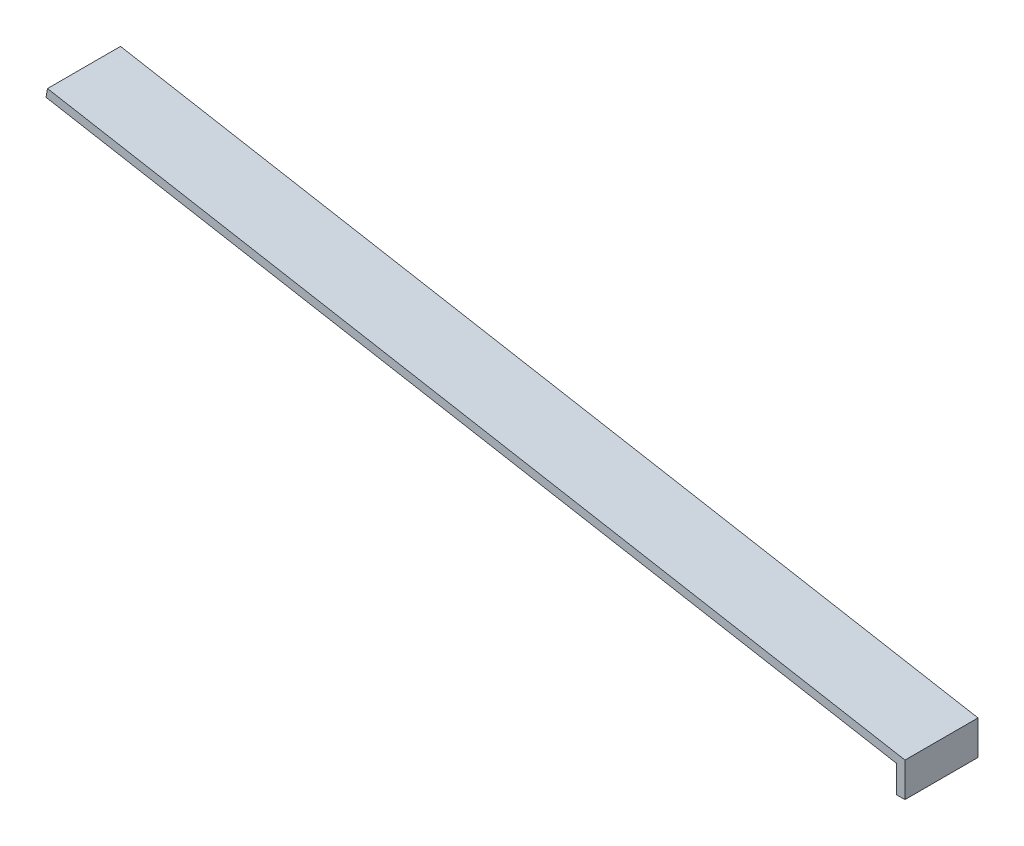
ISO-10303-21;
HEADER;
FILE_DESCRIPTION(('STEP AP214'),'2;1');
FILE_NAME('part.step','',(''),(''),'','','');
FILE_SCHEMA(('AUTOMOTIVE_DESIGN { 1 0 10303 214 1 1 1 1 }'));
ENDSEC;
DATA;
#1=APPLICATION_CONTEXT('core data for automotive mechanical design processes');
#2=APPLICATION_PROTOCOL_DEFINITION('international standard','automotive_design',2000,#1);
#3=PRODUCT_CONTEXT('',#1,'mechanical');
#4=PRODUCT('Part','Part','',(#3));
#5=PRODUCT_RELATED_PRODUCT_CATEGORY('part','',(#4));
#6=PRODUCT_DEFINITION_FORMATION('','',#4);
#7=PRODUCT_DEFINITION_CONTEXT('part definition',#1,'design');
#8=PRODUCT_DEFINITION('design','',#6,#7);
#9=PRODUCT_DEFINITION_SHAPE('','',#8);
#10=(LENGTH_UNIT() NAMED_UNIT(*) SI_UNIT(.MILLI.,.METRE.));
#11=(NAMED_UNIT(*) PLANE_ANGLE_UNIT() SI_UNIT($,.RADIAN.));
#12=(NAMED_UNIT(*) SI_UNIT($,.STERADIAN.) SOLID_ANGLE_UNIT());
#13=UNCERTAINTY_MEASURE_WITH_UNIT(LENGTH_MEASURE(1.E-05),#10,'distance_accuracy_value','');
#14=(GEOMETRIC_REPRESENTATION_CONTEXT(3) GLOBAL_UNCERTAINTY_ASSIGNED_CONTEXT((#13)) GLOBAL_UNIT_ASSIGNED_CONTEXT((#10,
#11,#12)) REPRESENTATION_CONTEXT('',''));
#15=CARTESIAN_POINT('',(0.,0.,0.));
#16=DIRECTION('',(0.,0.,1.));
#17=DIRECTION('',(1.,0.,0.));
#18=AXIS2_PLACEMENT_3D('',#15,#16,#17);
#19=CARTESIAN_POINT('',(0.5,2.02265126395991,2.15));
#20=DIRECTION('',(-0.175438596491228,-0.984490375199874,0.));
#21=DIRECTION('',(0.984490375199874,-0.175438596491228,0.));
#22=AXIS2_PLACEMENT_3D('',#19,#20,#21);
#23=PLANE('',#22);
#24=DIRECTION('',(-0.984490375199874,0.175438596491228,0.));
#25=VECTOR('',#24,1.);
#26=CARTESIAN_POINT('',(0.5,2.02265126395991,-2.15));
#27=LINE('',#26,#25);
#28=CARTESIAN_POINT('',(0.5,2.02265126395991,-2.15));
#29=VERTEX_POINT('',#28);
#30=CARTESIAN_POINT('',(-50.0043562477535,11.0226512639599,-2.15));
#31=VERTEX_POINT('',#30);
#32=EDGE_CURVE('E73',#29,#31,#27,.T.);
#33=ORIENTED_EDGE('',*,*,#32,.T.);
#34=DIRECTION('',(0.,0.,-1.));
#35=VECTOR('',#34,1.);
#36=CARTESIAN_POINT('',(-50.0043562477535,11.0226512639599,2.15));
#37=LINE('',#36,#35);
#38=CARTESIAN_POINT('',(-50.0043562477535,11.0226512639599,2.15));
#39=VERTEX_POINT('',#38);
#40=EDGE_CURVE('E11',#39,#31,#37,.T.);
#41=ORIENTED_EDGE('',*,*,#40,.F.);
#42=DIRECTION('',(-0.984490375199874,0.175438596491228,0.));
#43=VECTOR('',#42,1.);
#44=CARTESIAN_POINT('',(0.5,2.02265126395991,2.15));
#45=LINE('',#44,#43);
#46=CARTESIAN_POINT('',(0.5,2.02265126395991,2.15));
#47=VERTEX_POINT('',#46);
#48=EDGE_CURVE('E96',#47,#39,#45,.T.);
#49=ORIENTED_EDGE('',*,*,#48,.F.);
#50=DIRECTION('',(0.,0.,-1.));
#51=VECTOR('',#50,1.);
#52=CARTESIAN_POINT('',(0.5,2.02265126395991,2.15));
#53=LINE('',#52,#51);
#54=EDGE_CURVE('E86',#47,#29,#53,.T.);
#55=ORIENTED_EDGE('',*,*,#54,.T.);
#56=EDGE_LOOP('',(#33,#41,#49,#55));
#57=FACE_BOUND('',#56,.T.);
#58=ADVANCED_FACE('F17',(#57),#23,.F.);
#59=CARTESIAN_POINT('',(-50.0043562477535,11.0226512639599,2.15));
#60=DIRECTION('',(0.984490375199875,-0.175438596491218,0.));
#61=DIRECTION('',(0.175438596491218,0.984490375199876,0.));
#62=AXIS2_PLACEMENT_3D('',#59,#60,#61);
#63=PLANE('',#62);
#64=DIRECTION('',(-0.175438596491218,-0.984490375199875,0.));
#65=VECTOR('',#64,1.);
#66=CARTESIAN_POINT('',(-50.0043562477535,11.0226512639599,-2.15));
#67=LINE('',#66,#65);
#68=CARTESIAN_POINT('',(-50.0920755459991,10.53040607636,-2.15));
#69=VERTEX_POINT('',#68);
#70=EDGE_CURVE('E69',#31,#69,#67,.T.);
#71=ORIENTED_EDGE('',*,*,#70,.T.);
#72=DIRECTION('',(0.,0.,-1.));
#73=VECTOR('',#72,1.);
#74=CARTESIAN_POINT('',(-50.0920755459991,10.53040607636,2.15));
#75=LINE('',#74,#73);
#76=CARTESIAN_POINT('',(-50.0920755459991,10.53040607636,2.15));
#77=VERTEX_POINT('',#76);
#78=EDGE_CURVE('E24',#77,#69,#75,.T.);
#79=ORIENTED_EDGE('',*,*,#78,.F.);
#80=DIRECTION('',(-0.175438596491218,-0.984490375199875,0.));
#81=VECTOR('',#80,1.);
#82=CARTESIAN_POINT('',(-50.0043562477535,11.0226512639599,2.15));
#83=LINE('',#82,#81);
#84=EDGE_CURVE('E82',#39,#77,#83,.T.);
#85=ORIENTED_EDGE('',*,*,#84,.F.);
#86=ORIENTED_EDGE('',*,*,#40,.T.);
#87=EDGE_LOOP('',(#71,#79,#85,#86));
#88=FACE_BOUND('',#87,.T.);
#89=ADVANCED_FACE('F81',(#88),#63,.F.);
#90=CARTESIAN_POINT('',(-50.0920755459991,10.53040607636,2.15));
#91=DIRECTION('',(0.175438596491228,0.984490375199874,0.));
#92=DIRECTION('',(-0.984490375199874,0.175438596491228,0.));
#93=AXIS2_PLACEMENT_3D('',#90,#91,#92);
#94=PLANE('',#93);
#95=DIRECTION('',(0.984490375199874,-0.175438596491228,0.));
#96=VECTOR('',#95,1.);
#97=CARTESIAN_POINT('',(-50.0920755459991,10.53040607636,-2.15));
#98=LINE('',#97,#96);
#99=CARTESIAN_POINT('',(0.,1.60387550734504,-2.15));
#100=VERTEX_POINT('',#99);
#101=EDGE_CURVE('E75',#69,#100,#98,.T.);
#102=ORIENTED_EDGE('',*,*,#101,.T.);
#103=DIRECTION('',(0.,0.,-1.));
#104=VECTOR('',#103,1.);
#105=CARTESIAN_POINT('',(0.,1.60387550734504,2.15));
#106=LINE('',#105,#104);
#107=CARTESIAN_POINT('',(0.,1.60387550734504,2.15));
#108=VERTEX_POINT('',#107);
#109=EDGE_CURVE('E112',#108,#100,#106,.T.);
#110=ORIENTED_EDGE('',*,*,#109,.F.);
#111=DIRECTION('',(0.984490375199874,-0.175438596491228,0.));
#112=VECTOR('',#111,1.);
#113=CARTESIAN_POINT('',(-50.0920755459991,10.53040607636,2.15));
#114=LINE('',#113,#112);
#115=EDGE_CURVE('E99',#77,#108,#114,.T.);
#116=ORIENTED_EDGE('',*,*,#115,.F.);
#117=ORIENTED_EDGE('',*,*,#78,.T.);
#118=EDGE_LOOP('',(#102,#110,#116,#117));
#119=FACE_BOUND('',#118,.T.);
#120=ADVANCED_FACE('F116',(#119),#94,.F.);
#121=CARTESIAN_POINT('',(0.,1.60387550734504,2.15));
#122=DIRECTION('',(1.,0.,0.));
#123=DIRECTION('',(0.,1.,0.));
#124=AXIS2_PLACEMENT_3D('',#121,#122,#123);
#125=PLANE('',#124);
#126=DIRECTION('',(0.,-1.,0.));
#127=VECTOR('',#126,1.);
#128=CARTESIAN_POINT('',(0.,1.60387550734504,-2.15));
#129=LINE('',#128,#127);
#130=CARTESIAN_POINT('',(0.,0.,-2.15));
#131=VERTEX_POINT('',#130);
#132=EDGE_CURVE('E90',#100,#131,#129,.T.);
#133=ORIENTED_EDGE('',*,*,#132,.T.);
#134=DIRECTION('',(0.,0.,-1.));
#135=VECTOR('',#134,1.);
#136=CARTESIAN_POINT('',(0.,0.,2.15));
#137=LINE('',#136,#135);
#138=CARTESIAN_POINT('',(0.,0.,2.15));
#139=VERTEX_POINT('',#138);
#140=EDGE_CURVE('E109',#139,#131,#137,.T.);
#141=ORIENTED_EDGE('',*,*,#140,.F.);
#142=DIRECTION('',(0.,-1.,0.));
#143=VECTOR('',#142,1.);
#144=CARTESIAN_POINT('',(0.,1.60387550734504,2.15));
#145=LINE('',#144,#143);
#146=EDGE_CURVE('E101',#108,#139,#145,.T.);
#147=ORIENTED_EDGE('',*,*,#146,.F.);
#148=ORIENTED_EDGE('',*,*,#109,.T.);
#149=EDGE_LOOP('',(#133,#141,#147,#148));
#150=FACE_BOUND('',#149,.T.);
#151=ADVANCED_FACE('F122',(#150),#125,.F.);
#152=CARTESIAN_POINT('',(0.,0.,2.15));
#153=DIRECTION('',(-0.00872653549837453,0.999961923064171,0.));
#154=DIRECTION('',(-0.999961923064171,-0.00872653549837453,0.));
#155=AXIS2_PLACEMENT_3D('',#152,#153,#154);
#156=PLANE('',#155);
#157=DIRECTION('',(0.999961923064171,0.00872653549837453,0.));
#158=VECTOR('',#157,1.);
#159=CARTESIAN_POINT('',(0.,0.,-2.15));
#160=LINE('',#159,#158);
#161=CARTESIAN_POINT('',(0.5,0.00436343389537969,-2.15));
#162=VERTEX_POINT('',#161);
#163=EDGE_CURVE('E92',#131,#162,#160,.T.);
#164=ORIENTED_EDGE('',*,*,#163,.T.);
#165=DIRECTION('',(0.,0.,-1.));
#166=VECTOR('',#165,1.);
#167=CARTESIAN_POINT('',(0.5,0.00436343389537969,2.15));
#168=LINE('',#167,#166);
#169=CARTESIAN_POINT('',(0.5,0.00436343389537969,2.15));
#170=VERTEX_POINT('',#169);
#171=EDGE_CURVE('E106',#170,#162,#168,.T.);
#172=ORIENTED_EDGE('',*,*,#171,.F.);
#173=DIRECTION('',(0.999961923064171,0.00872653549837453,0.));
#174=VECTOR('',#173,1.);
#175=CARTESIAN_POINT('',(0.,0.,2.15));
#176=LINE('',#175,#174);
#177=EDGE_CURVE('E36',#139,#170,#176,.T.);
#178=ORIENTED_EDGE('',*,*,#177,.F.);
#179=ORIENTED_EDGE('',*,*,#140,.T.);
#180=EDGE_LOOP('',(#164,#172,#178,#179));
#181=FACE_BOUND('',#180,.T.);
#182=ADVANCED_FACE('F125',(#181),#156,.F.);
#183=CARTESIAN_POINT('',(0.5,0.00436343389537969,2.15));
#184=DIRECTION('',(-1.,0.,0.));
#185=DIRECTION('',(0.,0.,1.));
#186=AXIS2_PLACEMENT_3D('',#183,#184,#185);
#187=PLANE('',#186);
#188=DIRECTION('',(0.,1.,0.));
#189=VECTOR('',#188,1.);
#190=CARTESIAN_POINT('',(0.5,0.00436343389537969,-2.15));
#191=LINE('',#190,#189);
#192=EDGE_CURVE('E94',#162,#29,#191,.T.);
#193=ORIENTED_EDGE('',*,*,#192,.T.);
#194=ORIENTED_EDGE('',*,*,#54,.F.);
#195=DIRECTION('',(0.,1.,0.));
#196=VECTOR('',#195,1.);
#197=CARTESIAN_POINT('',(0.5,0.00436343389537969,2.15));
#198=LINE('',#197,#196);
#199=EDGE_CURVE('E31',#170,#47,#198,.T.);
#200=ORIENTED_EDGE('',*,*,#199,.F.);
#201=ORIENTED_EDGE('',*,*,#171,.T.);
#202=EDGE_LOOP('',(#193,#194,#200,#201));
#203=FACE_BOUND('',#202,.T.);
#204=ADVANCED_FACE('F127',(#203),#187,.F.);
#205=CARTESIAN_POINT('',(-50.0043562477535,11.0226512639599,2.15));
#206=DIRECTION('',(0.,0.,1.));
#207=DIRECTION('',(1.,0.,0.));
#208=AXIS2_PLACEMENT_3D('',#205,#206,#207);
#209=PLANE('',#208);
#210=ORIENTED_EDGE('',*,*,#48,.T.);
#211=ORIENTED_EDGE('',*,*,#84,.T.);
#212=ORIENTED_EDGE('',*,*,#115,.T.);
#213=ORIENTED_EDGE('',*,*,#146,.T.);
#214=ORIENTED_EDGE('',*,*,#177,.T.);
#215=ORIENTED_EDGE('',*,*,#199,.T.);
#216=EDGE_LOOP('',(#210,#211,#212,#213,#214,#215));
#217=FACE_BOUND('',#216,.T.);
#218=ADVANCED_FACE('F119',(#217),#209,.T.);
#219=CARTESIAN_POINT('',(-50.0043562477535,11.0226512639599,-2.15));
#220=DIRECTION('',(0.,0.,1.));
#221=DIRECTION('',(1.,0.,0.));
#222=AXIS2_PLACEMENT_3D('',#219,#220,#221);
#223=PLANE('',#222);
#224=ORIENTED_EDGE('',*,*,#32,.F.);
#225=ORIENTED_EDGE('',*,*,#192,.F.);
#226=ORIENTED_EDGE('',*,*,#163,.F.);
#227=ORIENTED_EDGE('',*,*,#132,.F.);
#228=ORIENTED_EDGE('',*,*,#101,.F.);
#229=ORIENTED_EDGE('',*,*,#70,.F.);
#230=EDGE_LOOP('',(#224,#225,#226,#227,#228,#229));
#231=FACE_BOUND('',#230,.T.);
#232=ADVANCED_FACE('F70',(#231),#223,.F.);
#233=CLOSED_SHELL('',(#58,#89,#120,#151,#182,#204,#218,#232));
#234=MANIFOLD_SOLID_BREP('B1',#233);
#235=ADVANCED_BREP_SHAPE_REPRESENTATION('',(#18,#234),#14);
#236=SHAPE_DEFINITION_REPRESENTATION(#9,#235);
ENDSEC;
END-ISO-10303-21;
